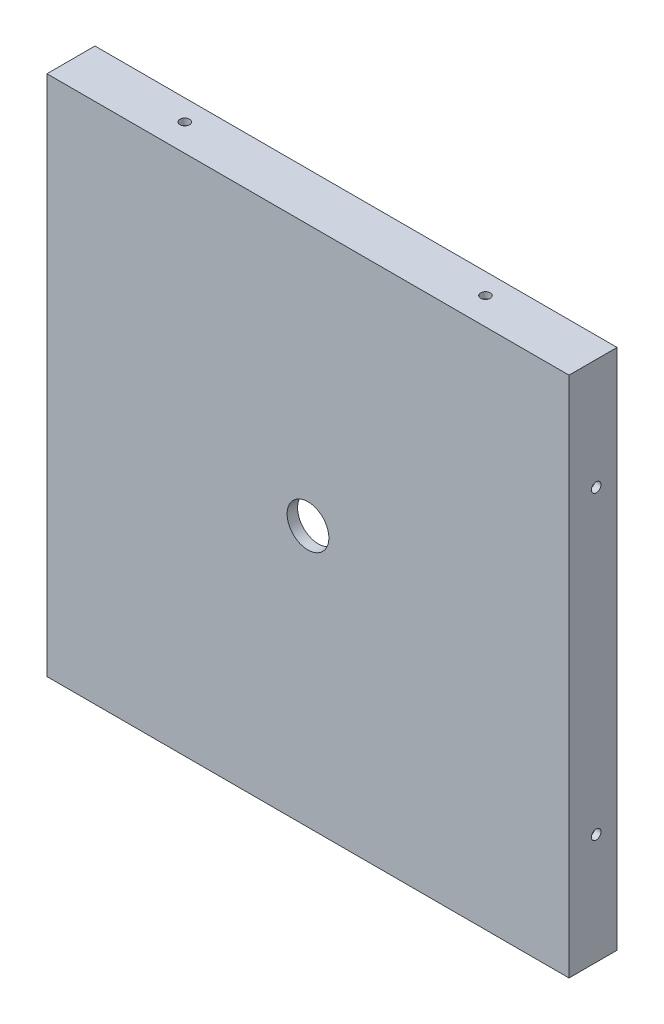
ISO-10303-21;
HEADER;
FILE_DESCRIPTION(('STEP AP214'),'2;1');
FILE_NAME('part.step','',(''),(''),'','','');
FILE_SCHEMA(('AUTOMOTIVE_DESIGN { 1 0 10303 214 1 1 1 1 }'));
ENDSEC;
DATA;
#1=APPLICATION_CONTEXT('core data for automotive mechanical design processes');
#2=APPLICATION_PROTOCOL_DEFINITION('international standard','automotive_design',2000,#1);
#3=PRODUCT_CONTEXT('',#1,'mechanical');
#4=PRODUCT('Part','Part','',(#3));
#5=PRODUCT_RELATED_PRODUCT_CATEGORY('part','',(#4));
#6=PRODUCT_DEFINITION_FORMATION('','',#4);
#7=PRODUCT_DEFINITION_CONTEXT('part definition',#1,'design');
#8=PRODUCT_DEFINITION('design','',#6,#7);
#9=PRODUCT_DEFINITION_SHAPE('','',#8);
#10=(LENGTH_UNIT() NAMED_UNIT(*) SI_UNIT(.MILLI.,.METRE.));
#11=(NAMED_UNIT(*) PLANE_ANGLE_UNIT() SI_UNIT($,.RADIAN.));
#12=(NAMED_UNIT(*) SI_UNIT($,.STERADIAN.) SOLID_ANGLE_UNIT());
#13=UNCERTAINTY_MEASURE_WITH_UNIT(LENGTH_MEASURE(1.E-05),#10,'distance_accuracy_value','');
#14=(GEOMETRIC_REPRESENTATION_CONTEXT(3) GLOBAL_UNCERTAINTY_ASSIGNED_CONTEXT((#13)) GLOBAL_UNIT_ASSIGNED_CONTEXT((#10,
#11,#12)) REPRESENTATION_CONTEXT('',''));
#15=CARTESIAN_POINT('',(0.,0.,0.));
#16=DIRECTION('',(0.,0.,1.));
#17=DIRECTION('',(1.,0.,0.));
#18=AXIS2_PLACEMENT_3D('',#15,#16,#17);
#19=CARTESIAN_POINT('',(0.,0.,5.));
#20=DIRECTION('',(0.,0.,1.));
#21=DIRECTION('',(1.,0.,0.));
#22=AXIS2_PLACEMENT_3D('',#19,#20,#21);
#23=PLANE('',#22);
#24=DIRECTION('',(0.,1.,0.));
#25=VECTOR('',#24,1.);
#26=CARTESIAN_POINT('',(125.,125.,5.));
#27=LINE('',#26,#25);
#28=CARTESIAN_POINT('',(125.,-125.,5.));
#29=VERTEX_POINT('',#28);
#30=CARTESIAN_POINT('',(125.,125.,5.));
#31=VERTEX_POINT('',#30);
#32=EDGE_CURVE('E183',#29,#31,#27,.T.);
#33=ORIENTED_EDGE('',*,*,#32,.T.);
#34=DIRECTION('',(-1.,0.,0.));
#35=VECTOR('',#34,1.);
#36=CARTESIAN_POINT('',(-125.,125.,5.));
#37=LINE('',#36,#35);
#38=CARTESIAN_POINT('',(-125.,125.,5.));
#39=VERTEX_POINT('',#38);
#40=EDGE_CURVE('E189',#31,#39,#37,.T.);
#41=ORIENTED_EDGE('',*,*,#40,.T.);
#42=DIRECTION('',(0.,-1.,0.));
#43=VECTOR('',#42,1.);
#44=CARTESIAN_POINT('',(-125.,125.,5.));
#45=LINE('',#44,#43);
#46=CARTESIAN_POINT('',(-125.,-125.,5.));
#47=VERTEX_POINT('',#46);
#48=EDGE_CURVE('E192',#39,#47,#45,.T.);
#49=ORIENTED_EDGE('',*,*,#48,.T.);
#50=DIRECTION('',(1.,0.,0.));
#51=VECTOR('',#50,1.);
#52=CARTESIAN_POINT('',(-125.,-125.,5.));
#53=LINE('',#52,#51);
#54=EDGE_CURVE('E66',#47,#29,#53,.T.);
#55=ORIENTED_EDGE('',*,*,#54,.T.);
#56=EDGE_LOOP('',(#33,#41,#49,#55));
#57=FACE_BOUND('',#56,.T.);
#58=CARTESIAN_POINT('',(0.,0.,5.));
#59=DIRECTION('',(0.,0.,1.));
#60=DIRECTION('',(1.,0.,0.));
#61=AXIS2_PLACEMENT_3D('',#58,#59,#60);
#62=CIRCLE('',#61,10.);
#63=CARTESIAN_POINT('',(10.,0.,5.));
#64=VERTEX_POINT('',#63);
#65=EDGE_CURVE('E179',#64,#64,#62,.T.);
#66=ORIENTED_EDGE('',*,*,#65,.F.);
#67=EDGE_LOOP('',(#66));
#68=FACE_BOUND('',#67,.T.);
#69=ADVANCED_FACE('F42',(#57,#68),#23,.T.);
#70=CARTESIAN_POINT('',(0.,0.,0.));
#71=DIRECTION('',(0.,0.,1.));
#72=DIRECTION('',(1.,0.,0.));
#73=AXIS2_PLACEMENT_3D('',#70,#71,#72);
#74=PLANE('',#73);
#75=DIRECTION('',(-1.,0.,0.));
#76=VECTOR('',#75,1.);
#77=CARTESIAN_POINT('',(122.,-122.,0.));
#78=LINE('',#77,#76);
#79=CARTESIAN_POINT('',(122.,-122.,0.));
#80=VERTEX_POINT('',#79);
#81=CARTESIAN_POINT('',(-122.,-122.,0.));
#82=VERTEX_POINT('',#81);
#83=EDGE_CURVE('E119',#80,#82,#78,.T.);
#84=ORIENTED_EDGE('',*,*,#83,.T.);
#85=DIRECTION('',(0.,1.,0.));
#86=VECTOR('',#85,1.);
#87=CARTESIAN_POINT('',(-122.,122.,0.));
#88=LINE('',#87,#86);
#89=CARTESIAN_POINT('',(-122.,122.,0.));
#90=VERTEX_POINT('',#89);
#91=EDGE_CURVE('E143',#82,#90,#88,.T.);
#92=ORIENTED_EDGE('',*,*,#91,.T.);
#93=DIRECTION('',(1.,0.,0.));
#94=VECTOR('',#93,1.);
#95=CARTESIAN_POINT('',(122.,122.,0.));
#96=LINE('',#95,#94);
#97=CARTESIAN_POINT('',(122.,122.,0.));
#98=VERTEX_POINT('',#97);
#99=EDGE_CURVE('E125',#90,#98,#96,.T.);
#100=ORIENTED_EDGE('',*,*,#99,.T.);
#101=DIRECTION('',(0.,-1.,0.));
#102=VECTOR('',#101,1.);
#103=CARTESIAN_POINT('',(122.,122.,0.));
#104=LINE('',#103,#102);
#105=EDGE_CURVE('E149',#98,#80,#104,.T.);
#106=ORIENTED_EDGE('',*,*,#105,.T.);
#107=EDGE_LOOP('',(#84,#92,#100,#106));
#108=FACE_BOUND('',#107,.T.);
#109=CARTESIAN_POINT('',(0.,0.,0.));
#110=DIRECTION('',(0.,0.,1.));
#111=DIRECTION('',(1.,0.,0.));
#112=AXIS2_PLACEMENT_3D('',#109,#110,#111);
#113=CIRCLE('',#112,10.);
#114=CARTESIAN_POINT('',(10.,0.,0.));
#115=VERTEX_POINT('',#114);
#116=EDGE_CURVE('E178',#115,#115,#113,.T.);
#117=ORIENTED_EDGE('',*,*,#116,.T.);
#118=EDGE_LOOP('',(#117));
#119=FACE_BOUND('',#118,.T.);
#120=ADVANCED_FACE('F222',(#108,#119),#74,.F.);
#121=CARTESIAN_POINT('',(125.,125.,5.));
#122=DIRECTION('',(-1.,0.,0.));
#123=DIRECTION('',(0.,0.,1.));
#124=AXIS2_PLACEMENT_3D('',#121,#122,#123);
#125=PLANE('',#124);
#126=CARTESIAN_POINT('',(125.,72.,-8.));
#127=DIRECTION('',(-1.,0.,0.));
#128=DIRECTION('',(0.,0.,1.));
#129=AXIS2_PLACEMENT_3D('',#126,#127,#128);
#130=CIRCLE('',#129,2.3);
#131=CARTESIAN_POINT('',(125.,72.,-5.7));
#132=VERTEX_POINT('',#131);
#133=EDGE_CURVE('E264',#132,#132,#130,.T.);
#134=ORIENTED_EDGE('',*,*,#133,.T.);
#135=EDGE_LOOP('',(#134));
#136=FACE_BOUND('',#135,.T.);
#137=CARTESIAN_POINT('',(125.,-71.9999999999999,-8.));
#138=DIRECTION('',(-1.,0.,0.));
#139=DIRECTION('',(0.,0.,1.));
#140=AXIS2_PLACEMENT_3D('',#137,#138,#139);
#141=CIRCLE('',#140,2.3);
#142=CARTESIAN_POINT('',(125.,-71.9999999999999,-5.7));
#143=VERTEX_POINT('',#142);
#144=EDGE_CURVE('E146',#143,#143,#141,.T.);
#145=ORIENTED_EDGE('',*,*,#144,.T.);
#146=EDGE_LOOP('',(#145));
#147=FACE_BOUND('',#146,.T.);
#148=DIRECTION('',(0.,0.,-1.));
#149=VECTOR('',#148,1.);
#150=CARTESIAN_POINT('',(125.,-125.,5.));
#151=LINE('',#150,#149);
#152=CARTESIAN_POINT('',(125.,-125.,-18.));
#153=VERTEX_POINT('',#152);
#154=EDGE_CURVE('E197',#29,#153,#151,.T.);
#155=ORIENTED_EDGE('',*,*,#154,.T.);
#156=DIRECTION('',(0.,-1.,0.));
#157=VECTOR('',#156,1.);
#158=CARTESIAN_POINT('',(125.,125.,-18.));
#159=LINE('',#158,#157);
#160=CARTESIAN_POINT('',(125.,125.,-18.));
#161=VERTEX_POINT('',#160);
#162=EDGE_CURVE('E170',#161,#153,#159,.T.);
#163=ORIENTED_EDGE('',*,*,#162,.F.);
#164=DIRECTION('',(0.,0.,-1.));
#165=VECTOR('',#164,1.);
#166=CARTESIAN_POINT('',(125.,125.,5.));
#167=LINE('',#166,#165);
#168=EDGE_CURVE('E11',#31,#161,#167,.T.);
#169=ORIENTED_EDGE('',*,*,#168,.F.);
#170=ORIENTED_EDGE('',*,*,#32,.F.);
#171=EDGE_LOOP('',(#155,#163,#169,#170));
#172=FACE_BOUND('',#171,.T.);
#173=ADVANCED_FACE('F44',(#136,#147,#172),#125,.F.);
#174=CARTESIAN_POINT('',(-125.,125.,5.));
#175=DIRECTION('',(0.,-1.,0.));
#176=DIRECTION('',(0.,0.,-1.));
#177=AXIS2_PLACEMENT_3D('',#174,#175,#176);
#178=PLANE('',#177);
#179=CARTESIAN_POINT('',(-72.0000000000004,125.,-8.));
#180=DIRECTION('',(0.,-1.,0.));
#181=DIRECTION('',(0.,0.,-1.));
#182=AXIS2_PLACEMENT_3D('',#179,#180,#181);
#183=CIRCLE('',#182,2.3);
#184=CARTESIAN_POINT('',(-72.0000000000004,125.,-10.3));
#185=VERTEX_POINT('',#184);
#186=EDGE_CURVE('E252',#185,#185,#183,.T.);
#187=ORIENTED_EDGE('',*,*,#186,.T.);
#188=EDGE_LOOP('',(#187));
#189=FACE_BOUND('',#188,.T.);
#190=CARTESIAN_POINT('',(71.9999999999995,125.,-8.));
#191=DIRECTION('',(0.,-1.,0.));
#192=DIRECTION('',(0.,0.,-1.));
#193=AXIS2_PLACEMENT_3D('',#190,#191,#192);
#194=CIRCLE('',#193,2.3);
#195=CARTESIAN_POINT('',(71.9999999999995,125.,-10.3));
#196=VERTEX_POINT('',#195);
#197=EDGE_CURVE('E255',#196,#196,#194,.T.);
#198=ORIENTED_EDGE('',*,*,#197,.T.);
#199=EDGE_LOOP('',(#198));
#200=FACE_BOUND('',#199,.T.);
#201=ORIENTED_EDGE('',*,*,#168,.T.);
#202=DIRECTION('',(1.,0.,0.));
#203=VECTOR('',#202,1.);
#204=CARTESIAN_POINT('',(125.,125.,-18.));
#205=LINE('',#204,#203);
#206=CARTESIAN_POINT('',(-125.,125.,-18.));
#207=VERTEX_POINT('',#206);
#208=EDGE_CURVE('E166',#207,#161,#205,.T.);
#209=ORIENTED_EDGE('',*,*,#208,.F.);
#210=DIRECTION('',(0.,0.,-1.));
#211=VECTOR('',#210,1.);
#212=CARTESIAN_POINT('',(-125.,125.,5.));
#213=LINE('',#212,#211);
#214=EDGE_CURVE('E51',#39,#207,#213,.T.);
#215=ORIENTED_EDGE('',*,*,#214,.F.);
#216=ORIENTED_EDGE('',*,*,#40,.F.);
#217=EDGE_LOOP('',(#201,#209,#215,#216));
#218=FACE_BOUND('',#217,.T.);
#219=ADVANCED_FACE('F211',(#189,#200,#218),#178,.F.);
#220=CARTESIAN_POINT('',(-125.,125.,5.));
#221=DIRECTION('',(1.,0.,0.));
#222=DIRECTION('',(0.,1.,0.));
#223=AXIS2_PLACEMENT_3D('',#220,#221,#222);
#224=PLANE('',#223);
#225=CARTESIAN_POINT('',(-125.,-72.,-8.));
#226=DIRECTION('',(1.,0.,0.));
#227=DIRECTION('',(0.,0.,-1.));
#228=AXIS2_PLACEMENT_3D('',#225,#226,#227);
#229=CIRCLE('',#228,2.3);
#230=CARTESIAN_POINT('',(-125.,-72.,-10.3));
#231=VERTEX_POINT('',#230);
#232=EDGE_CURVE('E490',#231,#231,#229,.T.);
#233=ORIENTED_EDGE('',*,*,#232,.T.);
#234=EDGE_LOOP('',(#233));
#235=FACE_BOUND('',#234,.T.);
#236=CARTESIAN_POINT('',(-125.,71.9999999999999,-8.));
#237=DIRECTION('',(1.,0.,0.));
#238=DIRECTION('',(0.,0.,-1.));
#239=AXIS2_PLACEMENT_3D('',#236,#237,#238);
#240=CIRCLE('',#239,2.3);
#241=CARTESIAN_POINT('',(-125.,71.9999999999999,-10.3));
#242=VERTEX_POINT('',#241);
#243=EDGE_CURVE('E498',#242,#242,#240,.T.);
#244=ORIENTED_EDGE('',*,*,#243,.T.);
#245=EDGE_LOOP('',(#244));
#246=FACE_BOUND('',#245,.T.);
#247=ORIENTED_EDGE('',*,*,#214,.T.);
#248=DIRECTION('',(0.,1.,0.));
#249=VECTOR('',#248,1.);
#250=CARTESIAN_POINT('',(-125.,125.,-18.));
#251=LINE('',#250,#249);
#252=CARTESIAN_POINT('',(-125.,-125.,-18.));
#253=VERTEX_POINT('',#252);
#254=EDGE_CURVE('E127',#253,#207,#251,.T.);
#255=ORIENTED_EDGE('',*,*,#254,.F.);
#256=DIRECTION('',(0.,0.,-1.));
#257=VECTOR('',#256,1.);
#258=CARTESIAN_POINT('',(-125.,-125.,5.));
#259=LINE('',#258,#257);
#260=EDGE_CURVE('E200',#47,#253,#259,.T.);
#261=ORIENTED_EDGE('',*,*,#260,.F.);
#262=ORIENTED_EDGE('',*,*,#48,.F.);
#263=EDGE_LOOP('',(#247,#255,#261,#262));
#264=FACE_BOUND('',#263,.T.);
#265=ADVANCED_FACE('F208',(#235,#246,#264),#224,.F.);
#266=CARTESIAN_POINT('',(-125.,-125.,5.));
#267=DIRECTION('',(0.,1.,0.));
#268=DIRECTION('',(0.,0.,1.));
#269=AXIS2_PLACEMENT_3D('',#266,#267,#268);
#270=PLANE('',#269);
#271=CARTESIAN_POINT('',(72.0000000000013,-125.000000000001,-8.));
#272=DIRECTION('',(0.,1.,0.));
#273=DIRECTION('',(0.,0.,1.));
#274=AXIS2_PLACEMENT_3D('',#271,#272,#273);
#275=CIRCLE('',#274,2.3);
#276=CARTESIAN_POINT('',(72.0000000000013,-125.000000000001,-5.7));
#277=VERTEX_POINT('',#276);
#278=EDGE_CURVE('E470',#277,#277,#275,.T.);
#279=ORIENTED_EDGE('',*,*,#278,.T.);
#280=EDGE_LOOP('',(#279));
#281=FACE_BOUND('',#280,.T.);
#282=CARTESIAN_POINT('',(-71.9999999999987,-125.000000000002,-8.));
#283=DIRECTION('',(0.,1.,0.));
#284=DIRECTION('',(0.,0.,1.));
#285=AXIS2_PLACEMENT_3D('',#282,#283,#284);
#286=CIRCLE('',#285,2.3);
#287=CARTESIAN_POINT('',(-71.9999999999987,-125.000000000002,-5.7));
#288=VERTEX_POINT('',#287);
#289=EDGE_CURVE('E482',#288,#288,#286,.T.);
#290=ORIENTED_EDGE('',*,*,#289,.T.);
#291=EDGE_LOOP('',(#290));
#292=FACE_BOUND('',#291,.T.);
#293=ORIENTED_EDGE('',*,*,#260,.T.);
#294=DIRECTION('',(-1.,0.,0.));
#295=VECTOR('',#294,1.);
#296=CARTESIAN_POINT('',(125.,-125.,-18.));
#297=LINE('',#296,#295);
#298=EDGE_CURVE('E174',#153,#253,#297,.T.);
#299=ORIENTED_EDGE('',*,*,#298,.F.);
#300=ORIENTED_EDGE('',*,*,#154,.F.);
#301=ORIENTED_EDGE('',*,*,#54,.F.);
#302=EDGE_LOOP('',(#293,#299,#300,#301));
#303=FACE_BOUND('',#302,.T.);
#304=ADVANCED_FACE('F217',(#281,#292,#303),#270,.F.);
#305=CARTESIAN_POINT('',(0.,0.,5.));
#306=DIRECTION('',(0.,0.,-1.));
#307=DIRECTION('',(-1.,0.,0.));
#308=AXIS2_PLACEMENT_3D('',#305,#306,#307);
#309=CYLINDRICAL_SURFACE('',#308,10.);
#310=ORIENTED_EDGE('',*,*,#65,.T.);
#311=EDGE_LOOP('',(#310));
#312=FACE_BOUND('',#311,.T.);
#313=ORIENTED_EDGE('',*,*,#116,.F.);
#314=EDGE_LOOP('',(#313));
#315=FACE_BOUND('',#314,.T.);
#316=ADVANCED_FACE('F226',(#312,#315),#309,.F.);
#317=CARTESIAN_POINT('',(0.,0.,-18.));
#318=DIRECTION('',(0.,0.,-1.));
#319=DIRECTION('',(-1.,0.,0.));
#320=AXIS2_PLACEMENT_3D('',#317,#318,#319);
#321=PLANE('',#320);
#322=ORIENTED_EDGE('',*,*,#254,.T.);
#323=ORIENTED_EDGE('',*,*,#208,.T.);
#324=ORIENTED_EDGE('',*,*,#162,.T.);
#325=ORIENTED_EDGE('',*,*,#298,.T.);
#326=EDGE_LOOP('',(#322,#323,#324,#325));
#327=FACE_BOUND('',#326,.T.);
#328=DIRECTION('',(1.,0.,0.));
#329=VECTOR('',#328,1.);
#330=CARTESIAN_POINT('',(122.,122.,-18.));
#331=LINE('',#330,#329);
#332=CARTESIAN_POINT('',(-122.,122.,-18.));
#333=VERTEX_POINT('',#332);
#334=CARTESIAN_POINT('',(122.,122.,-18.));
#335=VERTEX_POINT('',#334);
#336=EDGE_CURVE('E118',#333,#335,#331,.T.);
#337=ORIENTED_EDGE('',*,*,#336,.F.);
#338=DIRECTION('',(0.,1.,0.));
#339=VECTOR('',#338,1.);
#340=CARTESIAN_POINT('',(-122.,122.,-18.));
#341=LINE('',#340,#339);
#342=CARTESIAN_POINT('',(-122.,-122.,-18.));
#343=VERTEX_POINT('',#342);
#344=EDGE_CURVE('E109',#343,#333,#341,.T.);
#345=ORIENTED_EDGE('',*,*,#344,.F.);
#346=DIRECTION('',(-1.,0.,0.));
#347=VECTOR('',#346,1.);
#348=CARTESIAN_POINT('',(122.,-122.,-18.));
#349=LINE('',#348,#347);
#350=CARTESIAN_POINT('',(122.,-122.,-18.));
#351=VERTEX_POINT('',#350);
#352=EDGE_CURVE('E137',#351,#343,#349,.T.);
#353=ORIENTED_EDGE('',*,*,#352,.F.);
#354=DIRECTION('',(0.,-1.,0.));
#355=VECTOR('',#354,1.);
#356=CARTESIAN_POINT('',(122.,122.,-18.));
#357=LINE('',#356,#355);
#358=EDGE_CURVE('E133',#335,#351,#357,.T.);
#359=ORIENTED_EDGE('',*,*,#358,.F.);
#360=EDGE_LOOP('',(#337,#345,#353,#359));
#361=FACE_BOUND('',#360,.T.);
#362=ADVANCED_FACE('F131',(#327,#361),#321,.T.);
#363=CARTESIAN_POINT('',(-122.,122.,-18.));
#364=DIRECTION('',(1.,0.,0.));
#365=DIRECTION('',(0.,0.,-1.));
#366=AXIS2_PLACEMENT_3D('',#363,#364,#365);
#367=PLANE('',#366);
#368=CARTESIAN_POINT('',(-122.,-72.,-8.));
#369=DIRECTION('',(1.,0.,0.));
#370=DIRECTION('',(0.,0.,-1.));
#371=AXIS2_PLACEMENT_3D('',#368,#369,#370);
#372=CIRCLE('',#371,2.3);
#373=CARTESIAN_POINT('',(-122.,-72.,-10.3));
#374=VERTEX_POINT('',#373);
#375=EDGE_CURVE('E486',#374,#374,#372,.T.);
#376=ORIENTED_EDGE('',*,*,#375,.F.);
#377=EDGE_LOOP('',(#376));
#378=FACE_BOUND('',#377,.T.);
#379=CARTESIAN_POINT('',(-122.,71.9999999999999,-8.));
#380=DIRECTION('',(1.,0.,0.));
#381=DIRECTION('',(0.,0.,-1.));
#382=AXIS2_PLACEMENT_3D('',#379,#380,#381);
#383=CIRCLE('',#382,2.3);
#384=CARTESIAN_POINT('',(-122.,71.9999999999999,-10.3));
#385=VERTEX_POINT('',#384);
#386=EDGE_CURVE('E494',#385,#385,#383,.T.);
#387=ORIENTED_EDGE('',*,*,#386,.F.);
#388=EDGE_LOOP('',(#387));
#389=FACE_BOUND('',#388,.T.);
#390=ORIENTED_EDGE('',*,*,#91,.F.);
#391=DIRECTION('',(0.,0.,1.));
#392=VECTOR('',#391,1.);
#393=CARTESIAN_POINT('',(-122.,-122.,-18.));
#394=LINE('',#393,#392);
#395=EDGE_CURVE('E58',#343,#82,#394,.T.);
#396=ORIENTED_EDGE('',*,*,#395,.F.);
#397=ORIENTED_EDGE('',*,*,#344,.T.);
#398=DIRECTION('',(0.,0.,1.));
#399=VECTOR('',#398,1.);
#400=CARTESIAN_POINT('',(-122.,122.,-18.));
#401=LINE('',#400,#399);
#402=EDGE_CURVE('E112',#333,#90,#401,.T.);
#403=ORIENTED_EDGE('',*,*,#402,.T.);
#404=EDGE_LOOP('',(#390,#396,#397,#403));
#405=FACE_BOUND('',#404,.T.);
#406=ADVANCED_FACE('F111',(#378,#389,#405),#367,.T.);
#407=CARTESIAN_POINT('',(122.,122.,-18.));
#408=DIRECTION('',(0.,-1.,0.));
#409=DIRECTION('',(0.,0.,-1.));
#410=AXIS2_PLACEMENT_3D('',#407,#408,#409);
#411=PLANE('',#410);
#412=CARTESIAN_POINT('',(-72.0000000000004,122.,-8.));
#413=DIRECTION('',(0.,-1.,0.));
#414=DIRECTION('',(0.,0.,-1.));
#415=AXIS2_PLACEMENT_3D('',#412,#413,#414);
#416=CIRCLE('',#415,2.3);
#417=CARTESIAN_POINT('',(-72.0000000000004,122.,-10.3));
#418=VERTEX_POINT('',#417);
#419=EDGE_CURVE('E502',#418,#418,#416,.T.);
#420=ORIENTED_EDGE('',*,*,#419,.F.);
#421=EDGE_LOOP('',(#420));
#422=FACE_BOUND('',#421,.T.);
#423=CARTESIAN_POINT('',(71.9999999999995,122.,-8.));
#424=DIRECTION('',(0.,-1.,0.));
#425=DIRECTION('',(0.,0.,-1.));
#426=AXIS2_PLACEMENT_3D('',#423,#424,#425);
#427=CIRCLE('',#426,2.3);
#428=CARTESIAN_POINT('',(71.9999999999995,122.,-10.3));
#429=VERTEX_POINT('',#428);
#430=EDGE_CURVE('E259',#429,#429,#427,.T.);
#431=ORIENTED_EDGE('',*,*,#430,.F.);
#432=EDGE_LOOP('',(#431));
#433=FACE_BOUND('',#432,.T.);
#434=ORIENTED_EDGE('',*,*,#99,.F.);
#435=ORIENTED_EDGE('',*,*,#402,.F.);
#436=ORIENTED_EDGE('',*,*,#336,.T.);
#437=DIRECTION('',(0.,0.,1.));
#438=VECTOR('',#437,1.);
#439=CARTESIAN_POINT('',(122.,122.,-18.));
#440=LINE('',#439,#438);
#441=EDGE_CURVE('E128',#335,#98,#440,.T.);
#442=ORIENTED_EDGE('',*,*,#441,.T.);
#443=EDGE_LOOP('',(#434,#435,#436,#442));
#444=FACE_BOUND('',#443,.T.);
#445=ADVANCED_FACE('F122',(#422,#433,#444),#411,.T.);
#446=CARTESIAN_POINT('',(122.,122.,-18.));
#447=DIRECTION('',(-1.,0.,0.));
#448=DIRECTION('',(0.,0.,1.));
#449=AXIS2_PLACEMENT_3D('',#446,#447,#448);
#450=PLANE('',#449);
#451=CARTESIAN_POINT('',(122.,72.,-8.));
#452=DIRECTION('',(-1.,0.,0.));
#453=DIRECTION('',(0.,0.,1.));
#454=AXIS2_PLACEMENT_3D('',#451,#452,#453);
#455=CIRCLE('',#454,2.3);
#456=CARTESIAN_POINT('',(122.,72.,-5.7));
#457=VERTEX_POINT('',#456);
#458=EDGE_CURVE('E258',#457,#457,#455,.T.);
#459=ORIENTED_EDGE('',*,*,#458,.F.);
#460=EDGE_LOOP('',(#459));
#461=FACE_BOUND('',#460,.T.);
#462=CARTESIAN_POINT('',(122.,-71.9999999999999,-8.));
#463=DIRECTION('',(-1.,0.,0.));
#464=DIRECTION('',(0.,0.,1.));
#465=AXIS2_PLACEMENT_3D('',#462,#463,#464);
#466=CIRCLE('',#465,2.3);
#467=CARTESIAN_POINT('',(122.,-71.9999999999999,-5.7));
#468=VERTEX_POINT('',#467);
#469=EDGE_CURVE('E273',#468,#468,#466,.T.);
#470=ORIENTED_EDGE('',*,*,#469,.F.);
#471=EDGE_LOOP('',(#470));
#472=FACE_BOUND('',#471,.T.);
#473=ORIENTED_EDGE('',*,*,#105,.F.);
#474=ORIENTED_EDGE('',*,*,#441,.F.);
#475=ORIENTED_EDGE('',*,*,#358,.T.);
#476=DIRECTION('',(0.,0.,1.));
#477=VECTOR('',#476,1.);
#478=CARTESIAN_POINT('',(122.,-122.,-18.));
#479=LINE('',#478,#477);
#480=EDGE_CURVE('E158',#351,#80,#479,.T.);
#481=ORIENTED_EDGE('',*,*,#480,.T.);
#482=EDGE_LOOP('',(#473,#474,#475,#481));
#483=FACE_BOUND('',#482,.T.);
#484=ADVANCED_FACE('F289',(#461,#472,#483),#450,.T.);
#485=CARTESIAN_POINT('',(122.,-122.,-18.));
#486=DIRECTION('',(0.,1.,0.));
#487=DIRECTION('',(0.,0.,1.));
#488=AXIS2_PLACEMENT_3D('',#485,#486,#487);
#489=PLANE('',#488);
#490=CARTESIAN_POINT('',(72.0000000000013,-121.999999999999,-8.));
#491=DIRECTION('',(0.,1.,0.));
#492=DIRECTION('',(0.,0.,1.));
#493=AXIS2_PLACEMENT_3D('',#490,#491,#492);
#494=CIRCLE('',#493,2.3);
#495=CARTESIAN_POINT('',(72.0000000000013,-121.999999999999,-5.7));
#496=VERTEX_POINT('',#495);
#497=EDGE_CURVE('E472',#496,#496,#494,.T.);
#498=ORIENTED_EDGE('',*,*,#497,.F.);
#499=EDGE_LOOP('',(#498));
#500=FACE_BOUND('',#499,.T.);
#501=CARTESIAN_POINT('',(-71.9999999999987,-122.000000000001,-8.));
#502=DIRECTION('',(0.,1.,0.));
#503=DIRECTION('',(0.,0.,1.));
#504=AXIS2_PLACEMENT_3D('',#501,#502,#503);
#505=CIRCLE('',#504,2.3);
#506=CARTESIAN_POINT('',(-71.9999999999987,-122.000000000001,-5.7));
#507=VERTEX_POINT('',#506);
#508=EDGE_CURVE('E476',#507,#507,#505,.T.);
#509=ORIENTED_EDGE('',*,*,#508,.F.);
#510=EDGE_LOOP('',(#509));
#511=FACE_BOUND('',#510,.T.);
#512=ORIENTED_EDGE('',*,*,#83,.F.);
#513=ORIENTED_EDGE('',*,*,#480,.F.);
#514=ORIENTED_EDGE('',*,*,#352,.T.);
#515=ORIENTED_EDGE('',*,*,#395,.T.);
#516=EDGE_LOOP('',(#512,#513,#514,#515));
#517=FACE_BOUND('',#516,.T.);
#518=ADVANCED_FACE('F285',(#500,#511,#517),#489,.T.);
#519=CARTESIAN_POINT('',(122.,-71.9999999999999,-8.));
#520=DIRECTION('',(-1.,0.,0.));
#521=DIRECTION('',(0.,0.,1.));
#522=AXIS2_PLACEMENT_3D('',#519,#520,#521);
#523=CYLINDRICAL_SURFACE('',#522,2.3);
#524=ORIENTED_EDGE('',*,*,#144,.F.);
#525=EDGE_LOOP('',(#524));
#526=FACE_BOUND('',#525,.T.);
#527=ORIENTED_EDGE('',*,*,#469,.T.);
#528=EDGE_LOOP('',(#527));
#529=FACE_BOUND('',#528,.T.);
#530=ADVANCED_FACE('F281',(#526,#529),#523,.F.);
#531=CARTESIAN_POINT('',(122.,72.,-8.));
#532=DIRECTION('',(-1.,0.,0.));
#533=DIRECTION('',(0.,0.,1.));
#534=AXIS2_PLACEMENT_3D('',#531,#532,#533);
#535=CYLINDRICAL_SURFACE('',#534,2.3);
#536=ORIENTED_EDGE('',*,*,#133,.F.);
#537=EDGE_LOOP('',(#536));
#538=FACE_BOUND('',#537,.T.);
#539=ORIENTED_EDGE('',*,*,#458,.T.);
#540=EDGE_LOOP('',(#539));
#541=FACE_BOUND('',#540,.T.);
#542=ADVANCED_FACE('F284',(#538,#541),#535,.F.);
#543=CARTESIAN_POINT('',(71.9999999999995,122.,-8.));
#544=DIRECTION('',(0.,-1.,0.));
#545=DIRECTION('',(0.,0.,-1.));
#546=AXIS2_PLACEMENT_3D('',#543,#544,#545);
#547=CYLINDRICAL_SURFACE('',#546,2.3);
#548=ORIENTED_EDGE('',*,*,#197,.F.);
#549=EDGE_LOOP('',(#548));
#550=FACE_BOUND('',#549,.T.);
#551=ORIENTED_EDGE('',*,*,#430,.T.);
#552=EDGE_LOOP('',(#551));
#553=FACE_BOUND('',#552,.T.);
#554=ADVANCED_FACE('F348',(#550,#553),#547,.F.);
#555=CARTESIAN_POINT('',(-72.0000000000004,122.,-8.));
#556=DIRECTION('',(0.,-1.,0.));
#557=DIRECTION('',(0.,0.,-1.));
#558=AXIS2_PLACEMENT_3D('',#555,#556,#557);
#559=CYLINDRICAL_SURFACE('',#558,2.3);
#560=ORIENTED_EDGE('',*,*,#186,.F.);
#561=EDGE_LOOP('',(#560));
#562=FACE_BOUND('',#561,.T.);
#563=ORIENTED_EDGE('',*,*,#419,.T.);
#564=EDGE_LOOP('',(#563));
#565=FACE_BOUND('',#564,.T.);
#566=ADVANCED_FACE('F401',(#562,#565),#559,.F.);
#567=CARTESIAN_POINT('',(-122.,71.9999999999999,-8.));
#568=DIRECTION('',(1.,0.,0.));
#569=DIRECTION('',(0.,0.,-1.));
#570=AXIS2_PLACEMENT_3D('',#567,#568,#569);
#571=CYLINDRICAL_SURFACE('',#570,2.3);
#572=ORIENTED_EDGE('',*,*,#243,.F.);
#573=EDGE_LOOP('',(#572));
#574=FACE_BOUND('',#573,.T.);
#575=ORIENTED_EDGE('',*,*,#386,.T.);
#576=EDGE_LOOP('',(#575));
#577=FACE_BOUND('',#576,.T.);
#578=ADVANCED_FACE('F410',(#574,#577),#571,.F.);
#579=CARTESIAN_POINT('',(-122.,-72.,-8.));
#580=DIRECTION('',(1.,0.,0.));
#581=DIRECTION('',(0.,0.,-1.));
#582=AXIS2_PLACEMENT_3D('',#579,#580,#581);
#583=CYLINDRICAL_SURFACE('',#582,2.3);
#584=ORIENTED_EDGE('',*,*,#232,.F.);
#585=EDGE_LOOP('',(#584));
#586=FACE_BOUND('',#585,.T.);
#587=ORIENTED_EDGE('',*,*,#375,.T.);
#588=EDGE_LOOP('',(#587));
#589=FACE_BOUND('',#588,.T.);
#590=ADVANCED_FACE('F420',(#586,#589),#583,.F.);
#591=CARTESIAN_POINT('',(-71.9999999999987,-122.000000000001,-8.));
#592=DIRECTION('',(0.,1.,0.));
#593=DIRECTION('',(0.,0.,1.));
#594=AXIS2_PLACEMENT_3D('',#591,#592,#593);
#595=CYLINDRICAL_SURFACE('',#594,2.3);
#596=ORIENTED_EDGE('',*,*,#289,.F.);
#597=EDGE_LOOP('',(#596));
#598=FACE_BOUND('',#597,.T.);
#599=ORIENTED_EDGE('',*,*,#508,.T.);
#600=EDGE_LOOP('',(#599));
#601=FACE_BOUND('',#600,.T.);
#602=ADVANCED_FACE('F430',(#598,#601),#595,.F.);
#603=CARTESIAN_POINT('',(72.0000000000013,-121.999999999999,-8.));
#604=DIRECTION('',(0.,1.,0.));
#605=DIRECTION('',(0.,0.,1.));
#606=AXIS2_PLACEMENT_3D('',#603,#604,#605);
#607=CYLINDRICAL_SURFACE('',#606,2.3);
#608=ORIENTED_EDGE('',*,*,#278,.F.);
#609=EDGE_LOOP('',(#608));
#610=FACE_BOUND('',#609,.T.);
#611=ORIENTED_EDGE('',*,*,#497,.T.);
#612=EDGE_LOOP('',(#611));
#613=FACE_BOUND('',#612,.T.);
#614=ADVANCED_FACE('F440',(#610,#613),#607,.F.);
#615=CLOSED_SHELL('',(#69,#120,#173,#219,#265,#304,#316,#362,#406,#445,#484,#518,#530,#542,#554,
#566,#578,#590,#602,#614));
#616=MANIFOLD_SOLID_BREP('B2',#615);
#617=ADVANCED_BREP_SHAPE_REPRESENTATION('',(#18,#616),#14);
#618=SHAPE_DEFINITION_REPRESENTATION(#9,#617);
ENDSEC;
END-ISO-10303-21;
